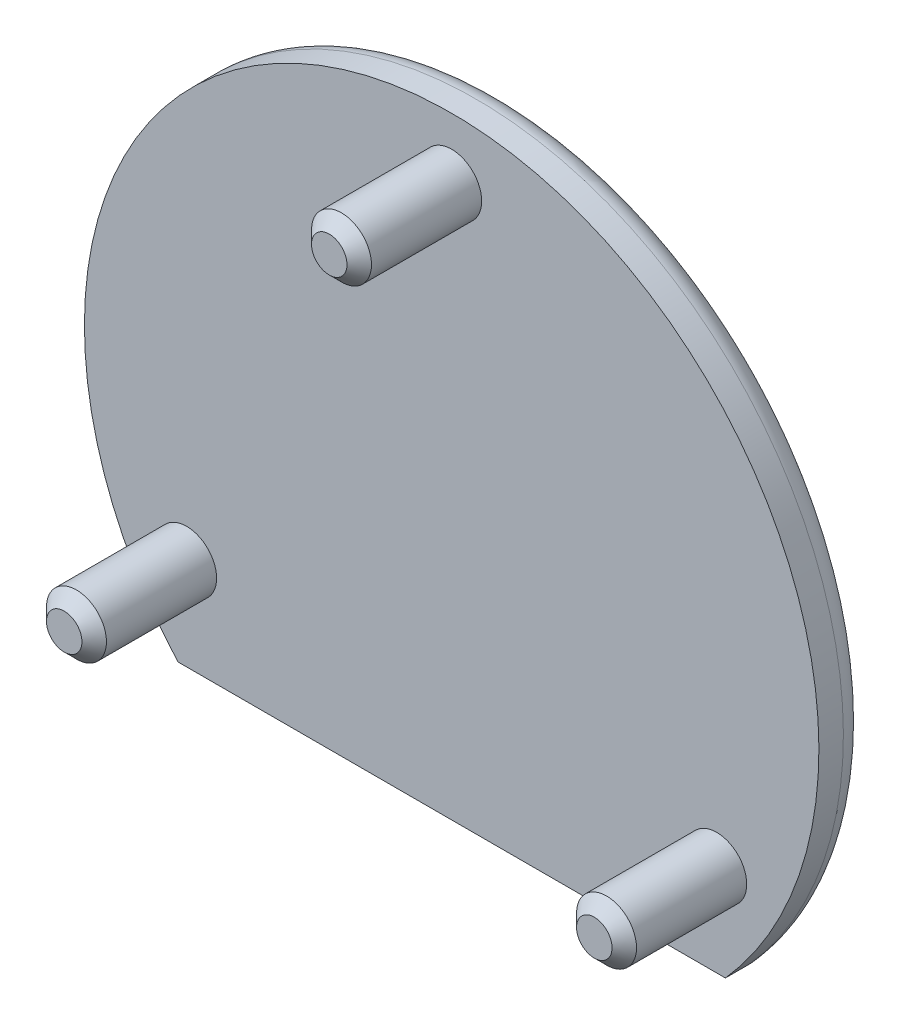
ISO-10303-21;
HEADER;
FILE_DESCRIPTION(('STEP AP214'),'2;1');
FILE_NAME('part.step','',(''),(''),'','','');
FILE_SCHEMA(('AUTOMOTIVE_DESIGN { 1 0 10303 214 1 1 1 1 }'));
ENDSEC;
DATA;
#1=APPLICATION_CONTEXT('core data for automotive mechanical design processes');
#2=APPLICATION_PROTOCOL_DEFINITION('international standard','automotive_design',2000,#1);
#3=PRODUCT_CONTEXT('',#1,'mechanical');
#4=PRODUCT('Part','Part','',(#3));
#5=PRODUCT_RELATED_PRODUCT_CATEGORY('part','',(#4));
#6=PRODUCT_DEFINITION_FORMATION('','',#4);
#7=PRODUCT_DEFINITION_CONTEXT('part definition',#1,'design');
#8=PRODUCT_DEFINITION('design','',#6,#7);
#9=PRODUCT_DEFINITION_SHAPE('','',#8);
#10=(LENGTH_UNIT() NAMED_UNIT(*) SI_UNIT(.MILLI.,.METRE.));
#11=(NAMED_UNIT(*) PLANE_ANGLE_UNIT() SI_UNIT($,.RADIAN.));
#12=(NAMED_UNIT(*) SI_UNIT($,.STERADIAN.) SOLID_ANGLE_UNIT());
#13=UNCERTAINTY_MEASURE_WITH_UNIT(LENGTH_MEASURE(1.E-05),#10,'distance_accuracy_value','');
#14=(GEOMETRIC_REPRESENTATION_CONTEXT(3) GLOBAL_UNCERTAINTY_ASSIGNED_CONTEXT((#13)) GLOBAL_UNIT_ASSIGNED_CONTEXT((#10,
#11,#12)) REPRESENTATION_CONTEXT('',''));
#15=CARTESIAN_POINT('',(0.,0.,0.));
#16=DIRECTION('',(0.,0.,1.));
#17=DIRECTION('',(1.,0.,0.));
#18=AXIS2_PLACEMENT_3D('',#15,#16,#17);
#19=CARTESIAN_POINT('',(0.,0.,4.));
#20=DIRECTION('',(0.,0.,-1.));
#21=DIRECTION('',(-1.,0.,0.));
#22=AXIS2_PLACEMENT_3D('',#19,#20,#21);
#23=CYLINDRICAL_SURFACE('',#22,30.);
#24=DIRECTION('',(0.,0.,-1.));
#25=VECTOR('',#24,1.);
#26=CARTESIAN_POINT('',(22.3606797749979,-20.,14.));
#27=LINE('',#26,#25);
#28=CARTESIAN_POINT('',(22.3606797749979,-20.,4.));
#29=VERTEX_POINT('',#28);
#30=CARTESIAN_POINT('',(22.3606797749979,-20.,2.));
#31=VERTEX_POINT('',#30);
#32=EDGE_CURVE('E74',#29,#31,#27,.T.);
#33=ORIENTED_EDGE('',*,*,#32,.T.);
#34=CARTESIAN_POINT('',(0.,0.,2.));
#35=DIRECTION('',(0.,0.,1.));
#36=DIRECTION('',(1.,0.,0.));
#37=AXIS2_PLACEMENT_3D('',#34,#35,#36);
#38=CIRCLE('',#37,30.);
#39=CARTESIAN_POINT('',(-22.3606797749979,-20.,2.));
#40=VERTEX_POINT('',#39);
#41=EDGE_CURVE('E55',#31,#40,#38,.T.);
#42=ORIENTED_EDGE('',*,*,#41,.T.);
#43=DIRECTION('',(0.,0.,-1.));
#44=VECTOR('',#43,1.);
#45=CARTESIAN_POINT('',(-22.3606797749979,-20.,14.));
#46=LINE('',#45,#44);
#47=CARTESIAN_POINT('',(-22.3606797749979,-20.,4.));
#48=VERTEX_POINT('',#47);
#49=EDGE_CURVE('E73',#48,#40,#46,.T.);
#50=ORIENTED_EDGE('',*,*,#49,.F.);
#51=CARTESIAN_POINT('',(0.,0.,4.));
#52=DIRECTION('',(0.,0.,1.));
#53=DIRECTION('',(1.,0.,0.));
#54=AXIS2_PLACEMENT_3D('',#51,#52,#53);
#55=CIRCLE('',#54,30.);
#56=EDGE_CURVE('E80',#29,#48,#55,.T.);
#57=ORIENTED_EDGE('',*,*,#56,.F.);
#58=EDGE_LOOP('',(#33,#42,#50,#57));
#59=FACE_BOUND('',#58,.T.);
#60=ADVANCED_FACE('F33',(#59),#23,.T.);
#61=CARTESIAN_POINT('',(0.,0.,4.));
#62=DIRECTION('',(0.,0.,1.));
#63=DIRECTION('',(1.,0.,0.));
#64=AXIS2_PLACEMENT_3D('',#61,#62,#63);
#65=PLANE('',#64);
#66=DIRECTION('',(-1.,0.,0.));
#67=VECTOR('',#66,1.);
#68=CARTESIAN_POINT('',(0.,-20.,4.));
#69=LINE('',#68,#67);
#70=EDGE_CURVE('E70',#29,#48,#69,.T.);
#71=ORIENTED_EDGE('',*,*,#70,.F.);
#72=ORIENTED_EDGE('',*,*,#56,.T.);
#73=EDGE_LOOP('',(#71,#72));
#74=FACE_BOUND('',#73,.T.);
#75=CARTESIAN_POINT('',(-21.6506350946097,-12.5000000000007,4.));
#76=DIRECTION('',(0.,0.,1.));
#77=DIRECTION('',(1.,0.,0.));
#78=AXIS2_PLACEMENT_3D('',#75,#76,#77);
#79=CIRCLE('',#78,2.45);
#80=CARTESIAN_POINT('',(-19.2006350946097,-12.5000000000007,4.));
#81=VERTEX_POINT('',#80);
#82=EDGE_CURVE('E78',#81,#81,#79,.T.);
#83=ORIENTED_EDGE('',*,*,#82,.F.);
#84=EDGE_LOOP('',(#83));
#85=FACE_BOUND('',#84,.T.);
#86=CARTESIAN_POINT('',(21.6506350946122,-12.4999999999993,4.));
#87=DIRECTION('',(0.,0.,1.));
#88=DIRECTION('',(1.,0.,0.));
#89=AXIS2_PLACEMENT_3D('',#86,#87,#88);
#90=CIRCLE('',#89,2.45);
#91=CARTESIAN_POINT('',(24.1006350946122,-12.4999999999993,4.));
#92=VERTEX_POINT('',#91);
#93=EDGE_CURVE('E90',#92,#92,#90,.T.);
#94=ORIENTED_EDGE('',*,*,#93,.F.);
#95=EDGE_LOOP('',(#94));
#96=FACE_BOUND('',#95,.T.);
#97=CARTESIAN_POINT('',(0.,25.,4.));
#98=DIRECTION('',(0.,0.,1.));
#99=DIRECTION('',(1.,0.,0.));
#100=AXIS2_PLACEMENT_3D('',#97,#98,#99);
#101=CIRCLE('',#100,2.45);
#102=CARTESIAN_POINT('',(2.45,25.,4.));
#103=VERTEX_POINT('',#102);
#104=EDGE_CURVE('E85',#103,#103,#101,.T.);
#105=ORIENTED_EDGE('',*,*,#104,.F.);
#106=EDGE_LOOP('',(#105));
#107=FACE_BOUND('',#106,.T.);
#108=ADVANCED_FACE('F82',(#74,#85,#96,#107),#65,.T.);
#109=CARTESIAN_POINT('',(0.,0.,0.));
#110=DIRECTION('',(0.,0.,1.));
#111=DIRECTION('',(1.,0.,0.));
#112=AXIS2_PLACEMENT_3D('',#109,#110,#111);
#113=PLANE('',#112);
#114=CARTESIAN_POINT('',(0.,0.,0.));
#115=DIRECTION('',(0.,0.,1.));
#116=DIRECTION('',(1.,0.,0.));
#117=AXIS2_PLACEMENT_3D('',#114,#115,#116);
#118=CIRCLE('',#117,28.);
#119=CARTESIAN_POINT('',(-21.4476105895273,-18.,0.));
#120=VERTEX_POINT('',#119);
#121=CARTESIAN_POINT('',(21.4476105895273,-18.,0.));
#122=VERTEX_POINT('',#121);
#123=EDGE_CURVE('E84',#120,#122,#118,.F.);
#124=ORIENTED_EDGE('',*,*,#123,.T.);
#125=DIRECTION('',(-1.,0.,0.));
#126=VECTOR('',#125,1.);
#127=CARTESIAN_POINT('',(0.,-18.,0.));
#128=LINE('',#127,#126);
#129=EDGE_CURVE('E87',#122,#120,#128,.T.);
#130=ORIENTED_EDGE('',*,*,#129,.T.);
#131=EDGE_LOOP('',(#124,#130));
#132=FACE_BOUND('',#131,.T.);
#133=ADVANCED_FACE('F138',(#132),#113,.F.);
#134=CARTESIAN_POINT('',(0.,25.,14.));
#135=DIRECTION('',(0.,0.,-1.));
#136=DIRECTION('',(-1.,0.,0.));
#137=AXIS2_PLACEMENT_3D('',#134,#135,#136);
#138=CYLINDRICAL_SURFACE('',#137,2.45);
#139=CARTESIAN_POINT('',(0.,25.,13.));
#140=DIRECTION('',(0.,0.,1.));
#141=DIRECTION('',(1.,0.,0.));
#142=AXIS2_PLACEMENT_3D('',#139,#140,#141);
#143=CIRCLE('',#142,2.45);
#144=CARTESIAN_POINT('',(2.45,25.,13.));
#145=VERTEX_POINT('',#144);
#146=EDGE_CURVE('E11',#145,#145,#143,.F.);
#147=ORIENTED_EDGE('',*,*,#146,.T.);
#148=EDGE_LOOP('',(#147));
#149=FACE_BOUND('',#148,.T.);
#150=ORIENTED_EDGE('',*,*,#104,.T.);
#151=EDGE_LOOP('',(#150));
#152=FACE_BOUND('',#151,.T.);
#153=ADVANCED_FACE('F142',(#149,#152),#138,.T.);
#154=CARTESIAN_POINT('',(0.,25.,14.));
#155=DIRECTION('',(0.,0.,1.));
#156=DIRECTION('',(1.,0.,0.));
#157=AXIS2_PLACEMENT_3D('',#154,#155,#156);
#158=PLANE('',#157);
#159=CARTESIAN_POINT('',(0.,25.,14.));
#160=DIRECTION('',(0.,0.,1.));
#161=DIRECTION('',(1.,0.,0.));
#162=AXIS2_PLACEMENT_3D('',#159,#160,#161);
#163=CIRCLE('',#162,1.45000000000001);
#164=CARTESIAN_POINT('',(1.45,25.,14.));
#165=VERTEX_POINT('',#164);
#166=EDGE_CURVE('E41',#165,#165,#163,.T.);
#167=ORIENTED_EDGE('',*,*,#166,.T.);
#168=EDGE_LOOP('',(#167));
#169=FACE_BOUND('',#168,.T.);
#170=ADVANCED_FACE('F147',(#169),#158,.T.);
#171=CARTESIAN_POINT('',(21.6506350946122,-12.4999999999993,14.));
#172=DIRECTION('',(0.,0.,-1.));
#173=DIRECTION('',(-1.,0.,0.));
#174=AXIS2_PLACEMENT_3D('',#171,#172,#173);
#175=CYLINDRICAL_SURFACE('',#174,2.45);
#176=CARTESIAN_POINT('',(21.6506350946122,-12.4999999999993,13.));
#177=DIRECTION('',(0.,0.,1.));
#178=DIRECTION('',(1.,0.,0.));
#179=AXIS2_PLACEMENT_3D('',#176,#177,#178);
#180=CIRCLE('',#179,2.45);
#181=CARTESIAN_POINT('',(24.1006350946122,-12.4999999999993,13.));
#182=VERTEX_POINT('',#181);
#183=EDGE_CURVE('E260',#182,#182,#180,.F.);
#184=ORIENTED_EDGE('',*,*,#183,.T.);
#185=EDGE_LOOP('',(#184));
#186=FACE_BOUND('',#185,.T.);
#187=ORIENTED_EDGE('',*,*,#93,.T.);
#188=EDGE_LOOP('',(#187));
#189=FACE_BOUND('',#188,.T.);
#190=ADVANCED_FACE('F151',(#186,#189),#175,.T.);
#191=CARTESIAN_POINT('',(21.6506350946122,-12.4999999999993,14.));
#192=DIRECTION('',(0.,0.,1.));
#193=DIRECTION('',(1.,0.,0.));
#194=AXIS2_PLACEMENT_3D('',#191,#192,#193);
#195=PLANE('',#194);
#196=CARTESIAN_POINT('',(21.6506350946122,-12.4999999999993,14.));
#197=DIRECTION('',(0.,0.,1.));
#198=DIRECTION('',(1.,0.,0.));
#199=AXIS2_PLACEMENT_3D('',#196,#197,#198);
#200=CIRCLE('',#199,1.45000000000001);
#201=CARTESIAN_POINT('',(23.1006350946123,-12.4999999999993,14.));
#202=VERTEX_POINT('',#201);
#203=EDGE_CURVE('E99',#202,#202,#200,.T.);
#204=ORIENTED_EDGE('',*,*,#203,.T.);
#205=EDGE_LOOP('',(#204));
#206=FACE_BOUND('',#205,.T.);
#207=ADVANCED_FACE('F155',(#206),#195,.T.);
#208=CARTESIAN_POINT('',(-21.6506350946097,-12.5000000000007,14.));
#209=DIRECTION('',(0.,0.,-1.));
#210=DIRECTION('',(-1.,0.,0.));
#211=AXIS2_PLACEMENT_3D('',#208,#209,#210);
#212=CYLINDRICAL_SURFACE('',#211,2.45);
#213=CARTESIAN_POINT('',(-21.6506350946097,-12.5000000000007,13.));
#214=DIRECTION('',(0.,0.,1.));
#215=DIRECTION('',(1.,0.,0.));
#216=AXIS2_PLACEMENT_3D('',#213,#214,#215);
#217=CIRCLE('',#216,2.45);
#218=CARTESIAN_POINT('',(-19.2006350946097,-12.5000000000007,13.));
#219=VERTEX_POINT('',#218);
#220=EDGE_CURVE('E259',#219,#219,#217,.F.);
#221=ORIENTED_EDGE('',*,*,#220,.T.);
#222=EDGE_LOOP('',(#221));
#223=FACE_BOUND('',#222,.T.);
#224=ORIENTED_EDGE('',*,*,#82,.T.);
#225=EDGE_LOOP('',(#224));
#226=FACE_BOUND('',#225,.T.);
#227=ADVANCED_FACE('F159',(#223,#226),#212,.T.);
#228=CARTESIAN_POINT('',(-21.6506350946097,-12.5000000000007,14.));
#229=DIRECTION('',(0.,0.,1.));
#230=DIRECTION('',(1.,0.,0.));
#231=AXIS2_PLACEMENT_3D('',#228,#229,#230);
#232=PLANE('',#231);
#233=CARTESIAN_POINT('',(-21.6506350946097,-12.5000000000007,14.));
#234=DIRECTION('',(0.,0.,1.));
#235=DIRECTION('',(1.,0.,0.));
#236=AXIS2_PLACEMENT_3D('',#233,#234,#235);
#237=CIRCLE('',#236,1.45000000000001);
#238=CARTESIAN_POINT('',(-20.2006350946097,-12.5000000000007,14.));
#239=VERTEX_POINT('',#238);
#240=EDGE_CURVE('E258',#239,#239,#237,.T.);
#241=ORIENTED_EDGE('',*,*,#240,.T.);
#242=EDGE_LOOP('',(#241));
#243=FACE_BOUND('',#242,.T.);
#244=ADVANCED_FACE('F163',(#243),#232,.T.);
#245=CARTESIAN_POINT('',(-22.3606797749979,-20.,14.));
#246=DIRECTION('',(0.,1.,0.));
#247=DIRECTION('',(0.,0.,1.));
#248=AXIS2_PLACEMENT_3D('',#245,#246,#247);
#249=PLANE('',#248);
#250=ORIENTED_EDGE('',*,*,#49,.T.);
#251=DIRECTION('',(-1.,0.,0.));
#252=VECTOR('',#251,1.);
#253=CARTESIAN_POINT('',(-22.3606797749979,-20.,2.));
#254=LINE('',#253,#252);
#255=EDGE_CURVE('E96',#40,#31,#254,.F.);
#256=ORIENTED_EDGE('',*,*,#255,.T.);
#257=ORIENTED_EDGE('',*,*,#32,.F.);
#258=ORIENTED_EDGE('',*,*,#70,.T.);
#259=EDGE_LOOP('',(#250,#256,#257,#258));
#260=FACE_BOUND('',#259,.T.);
#261=ADVANCED_FACE('F71',(#260),#249,.F.);
#262=CARTESIAN_POINT('',(0.,0.,2.));
#263=DIRECTION('',(0.,0.,1.));
#264=DIRECTION('',(1.,0.,0.));
#265=AXIS2_PLACEMENT_3D('',#262,#263,#264);
#266=TOROIDAL_SURFACE('',#265,28.,2.);
#267=CARTESIAN_POINT('',(-22.3606797749979,-20.,2.));
#268=CARTESIAN_POINT('',(-22.3606829628023,-20.0000076692253,1.94730880453729));
#269=CARTESIAN_POINT('',(-22.3597486202891,-19.9979178883467,1.89462164968865));
#270=CARTESIAN_POINT('',(-22.356029414005,-19.989602241929,1.78965186378717));
#271=CARTESIAN_POINT('',(-22.3532449601794,-19.9833772926552,1.73736914571542));
#272=CARTESIAN_POINT('',(-22.3458610826429,-19.9668747329203,1.63373582802444));
#273=CARTESIAN_POINT('',(-22.3412670990223,-19.9566092697483,1.58238291269659));
#274=CARTESIAN_POINT('',(-22.3303150863,-19.9321471037421,1.48082796065102));
#275=CARTESIAN_POINT('',(-22.3239570195826,-19.9179503170798,1.43062594849883));
#276=CARTESIAN_POINT('',(-22.3023264533742,-19.8696777328271,1.28230645019768));
#277=CARTESIAN_POINT('',(-22.2844879841764,-19.8298982016654,1.1863426665965));
#278=CARTESIAN_POINT('',(-22.2426353066962,-19.7367195107387,1.00279065737679));
#279=CARTESIAN_POINT('',(-22.2186183363656,-19.6833142597958,0.915206201753763));
#280=CARTESIAN_POINT('',(-22.1642671188187,-19.5626987554505,0.747399667847318));
#281=CARTESIAN_POINT('',(-22.1337434201348,-19.4950755961118,0.667536102586186));
#282=CARTESIAN_POINT('',(-22.0678596969659,-19.3494673569212,0.520244952315525));
#283=CARTESIAN_POINT('',(-22.0324982352454,-19.2714791979621,0.452821077006447));
#284=CARTESIAN_POINT('',(-21.9547953916614,-19.1005705902172,0.326394771528157));
#285=CARTESIAN_POINT('',(-21.9121187535284,-19.0069488690486,0.268547585518828));
#286=CARTESIAN_POINT('',(-21.8233365493595,-18.8128023947662,0.169359582369297));
#287=CARTESIAN_POINT('',(-21.7772290551861,-18.7122737624458,0.128028131443706));
#288=CARTESIAN_POINT('',(-21.6850657236404,-18.512002793257,0.0639311098134874));
#289=CARTESIAN_POINT('',(-21.6391203621992,-18.4124679729584,0.0403476142619648));
#290=CARTESIAN_POINT('',(-21.5461179250413,-18.2116521746249,0.00864312999767375));
#291=CARTESIAN_POINT('',(-21.4990633482974,-18.1103752390474,0.000490224881100798));
#292=CARTESIAN_POINT('',(-21.4504894715671,-18.006174822445,7.13357943511563E-06));
#293=CARTESIAN_POINT('',(-21.4490500604037,-18.0030873184837,-1.59308076666056E-08));
#294=CARTESIAN_POINT('',(-21.4476105895272,-18.,0.));
#295=B_SPLINE_CURVE_WITH_KNOTS('',3,(#267,#268,#269,#270,#271,#272,#273,#274,#275,#276,#277,
#278,#279,#280,#281,#282,#283,#284,#285,#286,#287,#288,#289,#290,#291,#292,#293,#294),
.UNSPECIFIED.,.F.,.F.,(4,2,2,2,2,2,2,2,2,2,2,2,2,4),(0.,0.15801699620063,0.315998990870918,
0.473509616731285,0.631023601464241,0.945651972201797,1.26042124012415,1.58605623652338,
1.91178818570889,2.26441919654917,2.61724990459874,2.9526109543699,3.28727758702823,
3.29749722492403),.UNSPECIFIED.);
#296=EDGE_CURVE('E100',#40,#120,#295,.T.);
#297=ORIENTED_EDGE('',*,*,#296,.F.);
#298=ORIENTED_EDGE('',*,*,#41,.F.);
#299=CARTESIAN_POINT('',(22.3606797749979,-20.,2.));
#300=CARTESIAN_POINT('',(22.3606829628023,-20.0000076692253,1.94730880453729));
#301=CARTESIAN_POINT('',(22.3597486202891,-19.9979178883467,1.89462164968865));
#302=CARTESIAN_POINT('',(22.356029414005,-19.989602241929,1.78965186378717));
#303=CARTESIAN_POINT('',(22.3532449601794,-19.9833772926552,1.73736914571542));
#304=CARTESIAN_POINT('',(22.3458610826429,-19.9668747329203,1.63373582802444));
#305=CARTESIAN_POINT('',(22.3412670990223,-19.9566092697483,1.58238291269659));
#306=CARTESIAN_POINT('',(22.3303150863,-19.9321471037421,1.48082796065102));
#307=CARTESIAN_POINT('',(22.3239570195826,-19.9179503170798,1.43062594849883));
#308=CARTESIAN_POINT('',(22.3023264533742,-19.8696777328271,1.28230645019768));
#309=CARTESIAN_POINT('',(22.2844879841764,-19.8298982016654,1.1863426665965));
#310=CARTESIAN_POINT('',(22.2426353066962,-19.7367195107387,1.00279065737679));
#311=CARTESIAN_POINT('',(22.2186183363656,-19.6833142597958,0.915206201753763));
#312=CARTESIAN_POINT('',(22.1642671188187,-19.5626987554505,0.747399667847318));
#313=CARTESIAN_POINT('',(22.1337434201348,-19.4950755961118,0.667536102586186));
#314=CARTESIAN_POINT('',(22.0678596969659,-19.3494673569212,0.520244952315525));
#315=CARTESIAN_POINT('',(22.0324982352454,-19.2714791979621,0.452821077006447));
#316=CARTESIAN_POINT('',(21.9547953916614,-19.1005705902172,0.326394771528157));
#317=CARTESIAN_POINT('',(21.9121187535284,-19.0069488690486,0.268547585518828));
#318=CARTESIAN_POINT('',(21.8233365493595,-18.8128023947662,0.169359582369297));
#319=CARTESIAN_POINT('',(21.7772290551861,-18.7122737624458,0.128028131443706));
#320=CARTESIAN_POINT('',(21.6850657236404,-18.512002793257,0.0639311098134874));
#321=CARTESIAN_POINT('',(21.6391203621992,-18.4124679729584,0.0403476142619648));
#322=CARTESIAN_POINT('',(21.5461179250413,-18.2116521746249,0.00864312999767375));
#323=CARTESIAN_POINT('',(21.4990633482974,-18.1103752390474,0.000490224881100798));
#324=CARTESIAN_POINT('',(21.4504894715671,-18.006174822445,7.13357943511563E-06));
#325=CARTESIAN_POINT('',(21.4490500604037,-18.0030873184837,-1.59308076666056E-08));
#326=CARTESIAN_POINT('',(21.4476105895272,-18.,0.));
#327=B_SPLINE_CURVE_WITH_KNOTS('',3,(#299,#300,#301,#302,#303,#304,#305,#306,#307,#308,#309,
#310,#311,#312,#313,#314,#315,#316,#317,#318,#319,#320,#321,#322,#323,#324,#325,#326),
.UNSPECIFIED.,.F.,.F.,(4,2,2,2,2,2,2,2,2,2,2,2,2,4),(0.,0.15801699620063,0.315998990870918,
0.473509616731285,0.631023601464241,0.945651972201797,1.26042124012415,1.58605623652338,
1.91178818570889,2.26441919654917,2.61724990459874,2.9526109543699,3.28727758702823,
3.29749722492403),.UNSPECIFIED.);
#328=EDGE_CURVE('E48',#122,#31,#327,.F.);
#329=ORIENTED_EDGE('',*,*,#328,.F.);
#330=ORIENTED_EDGE('',*,*,#123,.F.);
#331=EDGE_LOOP('',(#297,#298,#329,#330));
#332=FACE_BOUND('',#331,.T.);
#333=ADVANCED_FACE('F116',(#332),#266,.T.);
#334=CARTESIAN_POINT('',(0.,-18.,2.));
#335=DIRECTION('',(-1.,0.,0.));
#336=DIRECTION('',(0.,0.,1.));
#337=AXIS2_PLACEMENT_3D('',#334,#335,#336);
#338=CYLINDRICAL_SURFACE('',#337,2.);
#339=ORIENTED_EDGE('',*,*,#328,.T.);
#340=ORIENTED_EDGE('',*,*,#255,.F.);
#341=ORIENTED_EDGE('',*,*,#296,.T.);
#342=ORIENTED_EDGE('',*,*,#129,.F.);
#343=EDGE_LOOP('',(#339,#340,#341,#342));
#344=FACE_BOUND('',#343,.T.);
#345=ADVANCED_FACE('F113',(#344),#338,.T.);
#346=CARTESIAN_POINT('',(21.6506350946122,-12.4999999999993,14.));
#347=DIRECTION('',(0.,0.,-1.));
#348=DIRECTION('',(-1.,0.,0.));
#349=AXIS2_PLACEMENT_3D('',#346,#347,#348);
#350=CONICAL_SURFACE('',#349,1.45000000000001,0.785398163397447);
#351=ORIENTED_EDGE('',*,*,#183,.F.);
#352=EDGE_LOOP('',(#351));
#353=FACE_BOUND('',#352,.T.);
#354=ORIENTED_EDGE('',*,*,#203,.F.);
#355=EDGE_LOOP('',(#354));
#356=FACE_BOUND('',#355,.T.);
#357=ADVANCED_FACE('F121',(#353,#356),#350,.T.);
#358=CARTESIAN_POINT('',(-21.6506350946097,-12.5000000000007,14.));
#359=DIRECTION('',(0.,0.,-1.));
#360=DIRECTION('',(-1.,0.,0.));
#361=AXIS2_PLACEMENT_3D('',#358,#359,#360);
#362=CONICAL_SURFACE('',#361,1.45000000000001,0.785398163397447);
#363=ORIENTED_EDGE('',*,*,#220,.F.);
#364=EDGE_LOOP('',(#363));
#365=FACE_BOUND('',#364,.T.);
#366=ORIENTED_EDGE('',*,*,#240,.F.);
#367=EDGE_LOOP('',(#366));
#368=FACE_BOUND('',#367,.T.);
#369=ADVANCED_FACE('F124',(#365,#368),#362,.T.);
#370=CARTESIAN_POINT('',(0.,25.,14.));
#371=DIRECTION('',(0.,0.,-1.));
#372=DIRECTION('',(-1.,0.,0.));
#373=AXIS2_PLACEMENT_3D('',#370,#371,#372);
#374=CONICAL_SURFACE('',#373,1.45000000000001,0.785398163397447);
#375=ORIENTED_EDGE('',*,*,#146,.F.);
#376=EDGE_LOOP('',(#375));
#377=FACE_BOUND('',#376,.T.);
#378=ORIENTED_EDGE('',*,*,#166,.F.);
#379=EDGE_LOOP('',(#378));
#380=FACE_BOUND('',#379,.T.);
#381=ADVANCED_FACE('F35',(#377,#380),#374,.T.);
#382=CLOSED_SHELL('',(#60,#108,#133,#153,#170,#190,#207,#227,#244,#261,#333,#345,#357,#369,#381));
#383=MANIFOLD_SOLID_BREP('B2',#382);
#384=ADVANCED_BREP_SHAPE_REPRESENTATION('',(#18,#383),#14);
#385=SHAPE_DEFINITION_REPRESENTATION(#9,#384);
ENDSEC;
END-ISO-10303-21;
